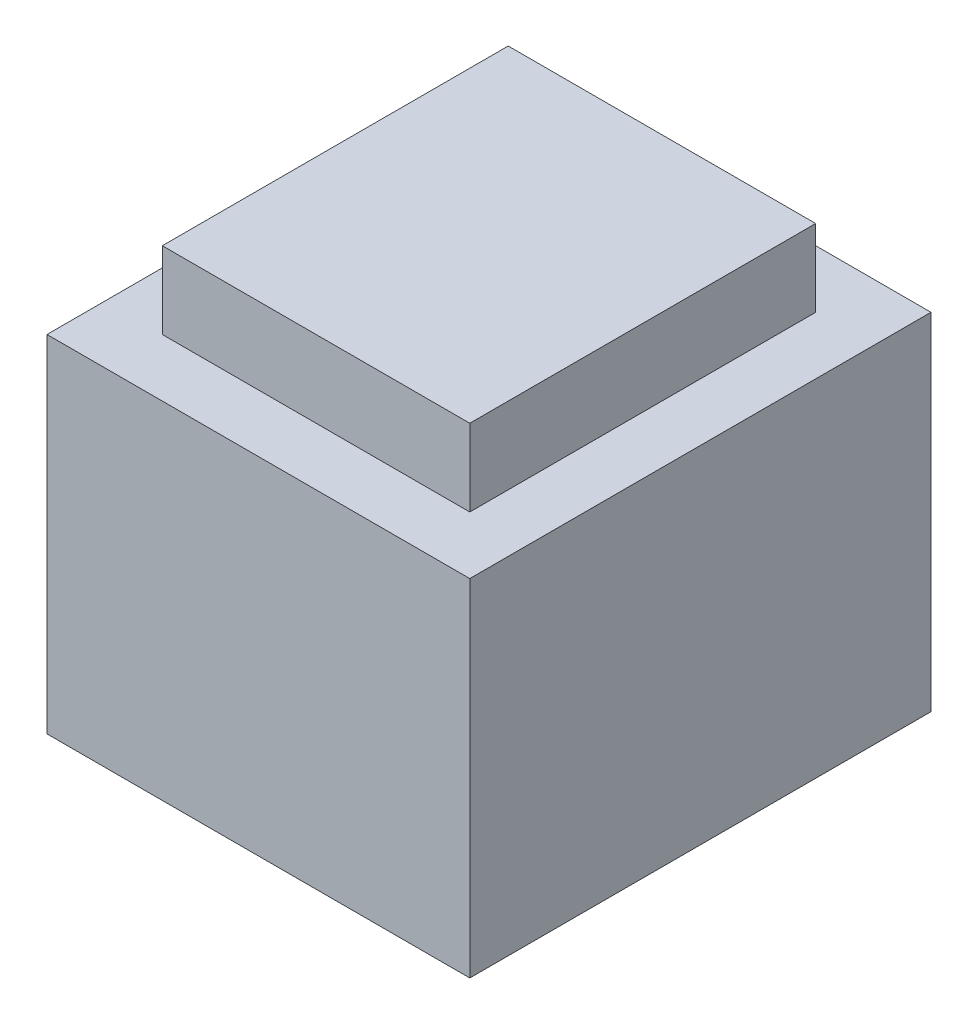
ISO-10303-21;
HEADER;
FILE_DESCRIPTION(('STEP AP214'),'2;1');
FILE_NAME('part.step','',(''),(''),'','','');
FILE_SCHEMA(('AUTOMOTIVE_DESIGN { 1 0 10303 214 1 1 1 1 }'));
ENDSEC;
DATA;
#1=APPLICATION_CONTEXT('core data for automotive mechanical design processes');
#2=APPLICATION_PROTOCOL_DEFINITION('international standard','automotive_design',2000,#1);
#3=PRODUCT_CONTEXT('',#1,'mechanical');
#4=PRODUCT('Part','Part','',(#3));
#5=PRODUCT_RELATED_PRODUCT_CATEGORY('part','',(#4));
#6=PRODUCT_DEFINITION_FORMATION('','',#4);
#7=PRODUCT_DEFINITION_CONTEXT('part definition',#1,'design');
#8=PRODUCT_DEFINITION('design','',#6,#7);
#9=PRODUCT_DEFINITION_SHAPE('','',#8);
#10=(LENGTH_UNIT() NAMED_UNIT(*) SI_UNIT(.MILLI.,.METRE.));
#11=(NAMED_UNIT(*) PLANE_ANGLE_UNIT() SI_UNIT($,.RADIAN.));
#12=(NAMED_UNIT(*) SI_UNIT($,.STERADIAN.) SOLID_ANGLE_UNIT());
#13=UNCERTAINTY_MEASURE_WITH_UNIT(LENGTH_MEASURE(1.E-05),#10,'distance_accuracy_value','');
#14=(GEOMETRIC_REPRESENTATION_CONTEXT(3) GLOBAL_UNCERTAINTY_ASSIGNED_CONTEXT((#13)) GLOBAL_UNIT_ASSIGNED_CONTEXT((#10,
#11,#12)) REPRESENTATION_CONTEXT('',''));
#15=CARTESIAN_POINT('',(0.,0.,0.));
#16=DIRECTION('',(0.,0.,1.));
#17=DIRECTION('',(1.,0.,0.));
#18=AXIS2_PLACEMENT_3D('',#15,#16,#17);
#19=CARTESIAN_POINT('',(-5.5,9.,6.));
#20=DIRECTION('',(1.,0.,0.));
#21=DIRECTION('',(0.,0.,-1.));
#22=AXIS2_PLACEMENT_3D('',#19,#20,#21);
#23=PLANE('',#22);
#24=DIRECTION('',(0.,0.,1.));
#25=VECTOR('',#24,1.);
#26=CARTESIAN_POINT('',(-5.5,0.,6.));
#27=LINE('',#26,#25);
#28=CARTESIAN_POINT('',(-5.5,0.,-6.));
#29=VERTEX_POINT('',#28);
#30=CARTESIAN_POINT('',(-5.5,0.,6.));
#31=VERTEX_POINT('',#30);
#32=EDGE_CURVE('E118',#29,#31,#27,.T.);
#33=ORIENTED_EDGE('',*,*,#32,.T.);
#34=DIRECTION('',(0.,-1.,0.));
#35=VECTOR('',#34,1.);
#36=CARTESIAN_POINT('',(-5.5,9.,6.));
#37=LINE('',#36,#35);
#38=CARTESIAN_POINT('',(-5.5,9.,6.));
#39=VERTEX_POINT('',#38);
#40=EDGE_CURVE('E11',#39,#31,#37,.T.);
#41=ORIENTED_EDGE('',*,*,#40,.F.);
#42=DIRECTION('',(0.,0.,1.));
#43=VECTOR('',#42,1.);
#44=CARTESIAN_POINT('',(-5.5,9.,6.));
#45=LINE('',#44,#43);
#46=CARTESIAN_POINT('',(-5.5,9.,-6.));
#47=VERTEX_POINT('',#46);
#48=EDGE_CURVE('E127',#47,#39,#45,.T.);
#49=ORIENTED_EDGE('',*,*,#48,.F.);
#50=DIRECTION('',(0.,-1.,0.));
#51=VECTOR('',#50,1.);
#52=CARTESIAN_POINT('',(-5.5,9.,-6.));
#53=LINE('',#52,#51);
#54=EDGE_CURVE('E136',#47,#29,#53,.T.);
#55=ORIENTED_EDGE('',*,*,#54,.T.);
#56=EDGE_LOOP('',(#33,#41,#49,#55));
#57=FACE_BOUND('',#56,.T.);
#58=ADVANCED_FACE('F34',(#57),#23,.F.);
#59=CARTESIAN_POINT('',(5.5,9.,6.));
#60=DIRECTION('',(0.,0.,-1.));
#61=DIRECTION('',(-1.,0.,0.));
#62=AXIS2_PLACEMENT_3D('',#59,#60,#61);
#63=PLANE('',#62);
#64=DIRECTION('',(1.,0.,0.));
#65=VECTOR('',#64,1.);
#66=CARTESIAN_POINT('',(5.5,0.,6.));
#67=LINE('',#66,#65);
#68=CARTESIAN_POINT('',(5.5,0.,6.));
#69=VERTEX_POINT('',#68);
#70=EDGE_CURVE('E121',#31,#69,#67,.T.);
#71=ORIENTED_EDGE('',*,*,#70,.T.);
#72=DIRECTION('',(0.,-1.,0.));
#73=VECTOR('',#72,1.);
#74=CARTESIAN_POINT('',(5.5,9.,6.));
#75=LINE('',#74,#73);
#76=CARTESIAN_POINT('',(5.5,9.,6.));
#77=VERTEX_POINT('',#76);
#78=EDGE_CURVE('E41',#77,#69,#75,.T.);
#79=ORIENTED_EDGE('',*,*,#78,.F.);
#80=DIRECTION('',(1.,0.,0.));
#81=VECTOR('',#80,1.);
#82=CARTESIAN_POINT('',(5.5,9.,6.));
#83=LINE('',#82,#81);
#84=EDGE_CURVE('E130',#39,#77,#83,.T.);
#85=ORIENTED_EDGE('',*,*,#84,.F.);
#86=ORIENTED_EDGE('',*,*,#40,.T.);
#87=EDGE_LOOP('',(#71,#79,#85,#86));
#88=FACE_BOUND('',#87,.T.);
#89=ADVANCED_FACE('F167',(#88),#63,.F.);
#90=CARTESIAN_POINT('',(5.5,9.,6.));
#91=DIRECTION('',(-1.,0.,0.));
#92=DIRECTION('',(0.,0.,1.));
#93=AXIS2_PLACEMENT_3D('',#90,#91,#92);
#94=PLANE('',#93);
#95=DIRECTION('',(0.,0.,-1.));
#96=VECTOR('',#95,1.);
#97=CARTESIAN_POINT('',(5.5,0.,6.));
#98=LINE('',#97,#96);
#99=CARTESIAN_POINT('',(5.5,0.,-6.));
#100=VERTEX_POINT('',#99);
#101=EDGE_CURVE('E139',#69,#100,#98,.T.);
#102=ORIENTED_EDGE('',*,*,#101,.T.);
#103=DIRECTION('',(0.,-1.,0.));
#104=VECTOR('',#103,1.);
#105=CARTESIAN_POINT('',(5.5,9.,-6.));
#106=LINE('',#105,#104);
#107=CARTESIAN_POINT('',(5.5,9.,-6.));
#108=VERTEX_POINT('',#107);
#109=EDGE_CURVE('E144',#108,#100,#106,.T.);
#110=ORIENTED_EDGE('',*,*,#109,.F.);
#111=DIRECTION('',(0.,0.,-1.));
#112=VECTOR('',#111,1.);
#113=CARTESIAN_POINT('',(5.5,9.,6.));
#114=LINE('',#113,#112);
#115=EDGE_CURVE('E133',#77,#108,#114,.T.);
#116=ORIENTED_EDGE('',*,*,#115,.F.);
#117=ORIENTED_EDGE('',*,*,#78,.T.);
#118=EDGE_LOOP('',(#102,#110,#116,#117));
#119=FACE_BOUND('',#118,.T.);
#120=ADVANCED_FACE('F151',(#119),#94,.F.);
#121=CARTESIAN_POINT('',(5.5,9.,-6.));
#122=DIRECTION('',(0.,0.,1.));
#123=DIRECTION('',(1.,0.,0.));
#124=AXIS2_PLACEMENT_3D('',#121,#122,#123);
#125=PLANE('',#124);
#126=DIRECTION('',(-1.,0.,0.));
#127=VECTOR('',#126,1.);
#128=CARTESIAN_POINT('',(5.5,0.,-6.));
#129=LINE('',#128,#127);
#130=EDGE_CURVE('E131',#100,#29,#129,.T.);
#131=ORIENTED_EDGE('',*,*,#130,.T.);
#132=ORIENTED_EDGE('',*,*,#54,.F.);
#133=DIRECTION('',(-1.,0.,0.));
#134=VECTOR('',#133,1.);
#135=CARTESIAN_POINT('',(5.5,9.,-6.));
#136=LINE('',#135,#134);
#137=EDGE_CURVE('E135',#108,#47,#136,.T.);
#138=ORIENTED_EDGE('',*,*,#137,.F.);
#139=ORIENTED_EDGE('',*,*,#109,.T.);
#140=EDGE_LOOP('',(#131,#132,#138,#139));
#141=FACE_BOUND('',#140,.T.);
#142=ADVANCED_FACE('F160',(#141),#125,.F.);
#143=CARTESIAN_POINT('',(0.,9.,0.));
#144=DIRECTION('',(0.,1.,0.));
#145=DIRECTION('',(0.,0.,1.));
#146=AXIS2_PLACEMENT_3D('',#143,#144,#145);
#147=PLANE('',#146);
#148=DIRECTION('',(0.,0.,-1.));
#149=VECTOR('',#148,1.);
#150=CARTESIAN_POINT('',(4.,9.,-4.5));
#151=LINE('',#150,#149);
#152=CARTESIAN_POINT('',(4.,9.,4.5));
#153=VERTEX_POINT('',#152);
#154=CARTESIAN_POINT('',(4.,9.,-4.5));
#155=VERTEX_POINT('',#154);
#156=EDGE_CURVE('E48',#153,#155,#151,.T.);
#157=ORIENTED_EDGE('',*,*,#156,.F.);
#158=DIRECTION('',(1.,0.,0.));
#159=VECTOR('',#158,1.);
#160=CARTESIAN_POINT('',(-4.,9.,4.5));
#161=LINE('',#160,#159);
#162=CARTESIAN_POINT('',(-4.,9.,4.5));
#163=VERTEX_POINT('',#162);
#164=EDGE_CURVE('E52',#163,#153,#161,.T.);
#165=ORIENTED_EDGE('',*,*,#164,.F.);
#166=DIRECTION('',(0.,0.,1.));
#167=VECTOR('',#166,1.);
#168=CARTESIAN_POINT('',(-4.,9.,-4.5));
#169=LINE('',#168,#167);
#170=CARTESIAN_POINT('',(-4.,9.,-4.5));
#171=VERTEX_POINT('',#170);
#172=EDGE_CURVE('E279',#171,#163,#169,.T.);
#173=ORIENTED_EDGE('',*,*,#172,.F.);
#174=DIRECTION('',(-1.,0.,0.));
#175=VECTOR('',#174,1.);
#176=CARTESIAN_POINT('',(-4.,9.,-4.5));
#177=LINE('',#176,#175);
#178=EDGE_CURVE('E285',#155,#171,#177,.T.);
#179=ORIENTED_EDGE('',*,*,#178,.F.);
#180=EDGE_LOOP('',(#157,#165,#173,#179));
#181=FACE_BOUND('',#180,.T.);
#182=ORIENTED_EDGE('',*,*,#48,.T.);
#183=ORIENTED_EDGE('',*,*,#84,.T.);
#184=ORIENTED_EDGE('',*,*,#115,.T.);
#185=ORIENTED_EDGE('',*,*,#137,.T.);
#186=EDGE_LOOP('',(#182,#183,#184,#185));
#187=FACE_BOUND('',#186,.T.);
#188=ADVANCED_FACE('F166',(#181,#187),#147,.T.);
#189=CARTESIAN_POINT('',(0.,0.,0.));
#190=DIRECTION('',(0.,1.,0.));
#191=DIRECTION('',(0.,0.,1.));
#192=AXIS2_PLACEMENT_3D('',#189,#190,#191);
#193=PLANE('',#192);
#194=ORIENTED_EDGE('',*,*,#32,.F.);
#195=ORIENTED_EDGE('',*,*,#130,.F.);
#196=ORIENTED_EDGE('',*,*,#101,.F.);
#197=ORIENTED_EDGE('',*,*,#70,.F.);
#198=EDGE_LOOP('',(#194,#195,#196,#197));
#199=FACE_BOUND('',#198,.T.);
#200=ADVANCED_FACE('F157',(#199),#193,.F.);
#201=CARTESIAN_POINT('',(4.,11.,-4.5));
#202=DIRECTION('',(-1.,0.,0.));
#203=DIRECTION('',(0.,0.,1.));
#204=AXIS2_PLACEMENT_3D('',#201,#202,#203);
#205=PLANE('',#204);
#206=ORIENTED_EDGE('',*,*,#156,.T.);
#207=DIRECTION('',(0.,-1.,0.));
#208=VECTOR('',#207,1.);
#209=CARTESIAN_POINT('',(4.,11.,-4.5));
#210=LINE('',#209,#208);
#211=CARTESIAN_POINT('',(4.,11.,-4.5));
#212=VERTEX_POINT('',#211);
#213=EDGE_CURVE('E101',#212,#155,#210,.T.);
#214=ORIENTED_EDGE('',*,*,#213,.F.);
#215=DIRECTION('',(0.,0.,-1.));
#216=VECTOR('',#215,1.);
#217=CARTESIAN_POINT('',(4.,11.,-4.5));
#218=LINE('',#217,#216);
#219=CARTESIAN_POINT('',(4.,11.,4.5));
#220=VERTEX_POINT('',#219);
#221=EDGE_CURVE('E107',#220,#212,#218,.T.);
#222=ORIENTED_EDGE('',*,*,#221,.F.);
#223=DIRECTION('',(0.,-1.,0.));
#224=VECTOR('',#223,1.);
#225=CARTESIAN_POINT('',(4.,11.,4.5));
#226=LINE('',#225,#224);
#227=EDGE_CURVE('E277',#220,#153,#226,.T.);
#228=ORIENTED_EDGE('',*,*,#227,.T.);
#229=EDGE_LOOP('',(#206,#214,#222,#228));
#230=FACE_BOUND('',#229,.T.);
#231=ADVANCED_FACE('F117',(#230),#205,.F.);
#232=CARTESIAN_POINT('',(-4.,11.,-4.5));
#233=DIRECTION('',(0.,0.,1.));
#234=DIRECTION('',(1.,0.,0.));
#235=AXIS2_PLACEMENT_3D('',#232,#233,#234);
#236=PLANE('',#235);
#237=ORIENTED_EDGE('',*,*,#178,.T.);
#238=DIRECTION('',(0.,-1.,0.));
#239=VECTOR('',#238,1.);
#240=CARTESIAN_POINT('',(-4.,11.,-4.5));
#241=LINE('',#240,#239);
#242=CARTESIAN_POINT('',(-4.,11.,-4.5));
#243=VERTEX_POINT('',#242);
#244=EDGE_CURVE('E103',#243,#171,#241,.T.);
#245=ORIENTED_EDGE('',*,*,#244,.F.);
#246=DIRECTION('',(-1.,0.,0.));
#247=VECTOR('',#246,1.);
#248=CARTESIAN_POINT('',(-4.,11.,-4.5));
#249=LINE('',#248,#247);
#250=EDGE_CURVE('E96',#212,#243,#249,.T.);
#251=ORIENTED_EDGE('',*,*,#250,.F.);
#252=ORIENTED_EDGE('',*,*,#213,.T.);
#253=EDGE_LOOP('',(#237,#245,#251,#252));
#254=FACE_BOUND('',#253,.T.);
#255=ADVANCED_FACE('F99',(#254),#236,.F.);
#256=CARTESIAN_POINT('',(-4.,11.,-4.5));
#257=DIRECTION('',(1.,0.,0.));
#258=DIRECTION('',(0.,0.,-1.));
#259=AXIS2_PLACEMENT_3D('',#256,#257,#258);
#260=PLANE('',#259);
#261=ORIENTED_EDGE('',*,*,#172,.T.);
#262=DIRECTION('',(0.,-1.,0.));
#263=VECTOR('',#262,1.);
#264=CARTESIAN_POINT('',(-4.,11.,4.5));
#265=LINE('',#264,#263);
#266=CARTESIAN_POINT('',(-4.,11.,4.5));
#267=VERTEX_POINT('',#266);
#268=EDGE_CURVE('E123',#267,#163,#265,.T.);
#269=ORIENTED_EDGE('',*,*,#268,.F.);
#270=DIRECTION('',(0.,0.,1.));
#271=VECTOR('',#270,1.);
#272=CARTESIAN_POINT('',(-4.,11.,-4.5));
#273=LINE('',#272,#271);
#274=EDGE_CURVE('E106',#243,#267,#273,.T.);
#275=ORIENTED_EDGE('',*,*,#274,.F.);
#276=ORIENTED_EDGE('',*,*,#244,.T.);
#277=EDGE_LOOP('',(#261,#269,#275,#276));
#278=FACE_BOUND('',#277,.T.);
#279=ADVANCED_FACE('F185',(#278),#260,.F.);
#280=CARTESIAN_POINT('',(-4.,11.,4.5));
#281=DIRECTION('',(0.,0.,-1.));
#282=DIRECTION('',(-1.,0.,0.));
#283=AXIS2_PLACEMENT_3D('',#280,#281,#282);
#284=PLANE('',#283);
#285=ORIENTED_EDGE('',*,*,#164,.T.);
#286=ORIENTED_EDGE('',*,*,#227,.F.);
#287=DIRECTION('',(1.,0.,0.));
#288=VECTOR('',#287,1.);
#289=CARTESIAN_POINT('',(-4.,11.,4.5));
#290=LINE('',#289,#288);
#291=EDGE_CURVE('E112',#267,#220,#290,.T.);
#292=ORIENTED_EDGE('',*,*,#291,.F.);
#293=ORIENTED_EDGE('',*,*,#268,.T.);
#294=EDGE_LOOP('',(#285,#286,#292,#293));
#295=FACE_BOUND('',#294,.T.);
#296=ADVANCED_FACE('F188',(#295),#284,.F.);
#297=CARTESIAN_POINT('',(0.,11.,0.));
#298=DIRECTION('',(0.,1.,0.));
#299=DIRECTION('',(0.,0.,1.));
#300=AXIS2_PLACEMENT_3D('',#297,#298,#299);
#301=PLANE('',#300);
#302=ORIENTED_EDGE('',*,*,#221,.T.);
#303=ORIENTED_EDGE('',*,*,#250,.T.);
#304=ORIENTED_EDGE('',*,*,#274,.T.);
#305=ORIENTED_EDGE('',*,*,#291,.T.);
#306=EDGE_LOOP('',(#302,#303,#304,#305));
#307=FACE_BOUND('',#306,.T.);
#308=ADVANCED_FACE('F110',(#307),#301,.T.);
#309=CLOSED_SHELL('',(#58,#89,#120,#142,#188,#200,#231,#255,#279,#296,#308));
#310=MANIFOLD_SOLID_BREP('B2',#309);
#311=ADVANCED_BREP_SHAPE_REPRESENTATION('',(#18,#310),#14);
#312=SHAPE_DEFINITION_REPRESENTATION(#9,#311);
ENDSEC;
END-ISO-10303-21;
